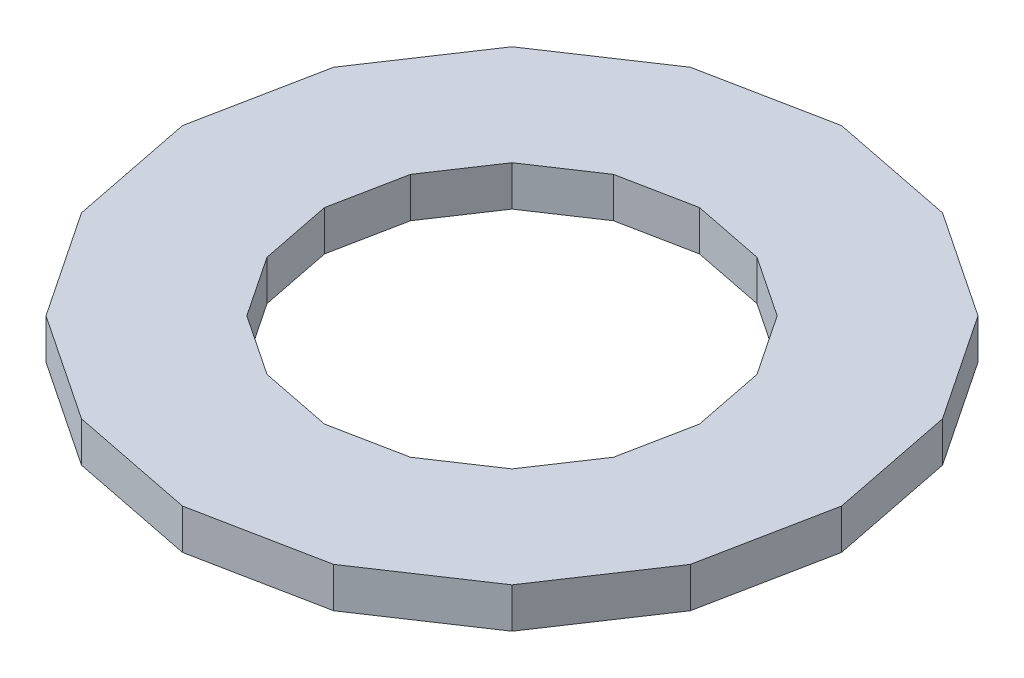
ISO-10303-21;
HEADER;
FILE_DESCRIPTION(('STEP AP214'),'2;1');
FILE_NAME('part.step','',(''),(''),'','','');
FILE_SCHEMA(('AUTOMOTIVE_DESIGN { 1 0 10303 214 1 1 1 1 }'));
ENDSEC;
DATA;
#1=APPLICATION_CONTEXT('core data for automotive mechanical design processes');
#2=APPLICATION_PROTOCOL_DEFINITION('international standard','automotive_design',2000,#1);
#3=PRODUCT_CONTEXT('',#1,'mechanical');
#4=PRODUCT('Part','Part','',(#3));
#5=PRODUCT_RELATED_PRODUCT_CATEGORY('part','',(#4));
#6=PRODUCT_DEFINITION_FORMATION('','',#4);
#7=PRODUCT_DEFINITION_CONTEXT('part definition',#1,'design');
#8=PRODUCT_DEFINITION('design','',#6,#7);
#9=PRODUCT_DEFINITION_SHAPE('','',#8);
#10=(LENGTH_UNIT() NAMED_UNIT(*) SI_UNIT(.MILLI.,.METRE.));
#11=(NAMED_UNIT(*) PLANE_ANGLE_UNIT() SI_UNIT($,.RADIAN.));
#12=(NAMED_UNIT(*) SI_UNIT($,.STERADIAN.) SOLID_ANGLE_UNIT());
#13=UNCERTAINTY_MEASURE_WITH_UNIT(LENGTH_MEASURE(1.E-05),#10,'distance_accuracy_value','');
#14=(GEOMETRIC_REPRESENTATION_CONTEXT(3) GLOBAL_UNCERTAINTY_ASSIGNED_CONTEXT((#13)) GLOBAL_UNIT_ASSIGNED_CONTEXT((#10,
#11,#12)) REPRESENTATION_CONTEXT('',''));
#15=CARTESIAN_POINT('',(0.,0.,0.));
#16=DIRECTION('',(0.,0.,1.));
#17=DIRECTION('',(1.,0.,0.));
#18=AXIS2_PLACEMENT_3D('',#15,#16,#17);
#19=CARTESIAN_POINT('',(0.,19.05,0.));
#20=DIRECTION('',(0.,1.,0.));
#21=DIRECTION('',(0.,0.,1.));
#22=AXIS2_PLACEMENT_3D('',#19,#20,#21);
#23=PLANE('',#22);
#24=DIRECTION('',(0.195090322016117,0.,-0.980785280403233));
#25=VECTOR('',#24,1.);
#26=CARTESIAN_POINT('',(144.34261966422,19.05,59.7886706933794));
#27=LINE('',#26,#25);
#28=CARTESIAN_POINT('',(144.34261966422,19.05,59.7886706933794));
#29=VERTEX_POINT('',#28);
#30=CARTESIAN_POINT('',(156.235325694323,19.05,-1.88390487844212E-12));
#31=VERTEX_POINT('',#30);
#32=EDGE_CURVE('E373',#29,#31,#27,.T.);
#33=ORIENTED_EDGE('',*,*,#32,.T.);
#34=DIRECTION('',(-0.19509032201614,0.,-0.980785280403228));
#35=VECTOR('',#34,1.);
#36=CARTESIAN_POINT('',(156.235325694323,19.05,-1.88390487844212E-12));
#37=LINE('',#36,#35);
#38=CARTESIAN_POINT('',(144.342619664219,19.05,-59.7886706933827));
#39=VERTEX_POINT('',#38);
#40=EDGE_CURVE('E376',#31,#39,#37,.T.);
#41=ORIENTED_EDGE('',*,*,#40,.T.);
#42=DIRECTION('',(-0.555570233019612,0.,-0.831469612302539));
#43=VECTOR('',#42,1.);
#44=CARTESIAN_POINT('',(144.342619664219,19.05,-59.7886706933827));
#45=LINE('',#44,#43);
#46=CARTESIAN_POINT('',(110.475058259343,19.05,-110.475058259346));
#47=VERTEX_POINT('',#46);
#48=EDGE_CURVE('E380',#39,#47,#45,.T.);
#49=ORIENTED_EDGE('',*,*,#48,.T.);
#50=DIRECTION('',(-0.831469612302552,0.,-0.555570233019592));
#51=VECTOR('',#50,1.);
#52=CARTESIAN_POINT('',(110.475058259343,19.05,-110.475058259346));
#53=LINE('',#52,#51);
#54=CARTESIAN_POINT('',(59.7886706933795,19.05,-144.34261966422));
#55=VERTEX_POINT('',#54);
#56=EDGE_CURVE('E383',#47,#55,#53,.T.);
#57=ORIENTED_EDGE('',*,*,#56,.T.);
#58=DIRECTION('',(-0.980785280403233,0.,-0.195090322016117));
#59=VECTOR('',#58,1.);
#60=CARTESIAN_POINT('',(59.7886706933795,19.05,-144.34261966422));
#61=LINE('',#60,#59);
#62=CARTESIAN_POINT('',(-1.93066864257627E-12,19.05,-156.235325694322));
#63=VERTEX_POINT('',#62);
#64=EDGE_CURVE('E385',#55,#63,#61,.T.);
#65=ORIENTED_EDGE('',*,*,#64,.T.);
#66=DIRECTION('',(-0.980785280403228,0.,0.19509032201614));
#67=VECTOR('',#66,1.);
#68=CARTESIAN_POINT('',(-1.93066864257627E-12,19.05,-156.235325694322));
#69=LINE('',#68,#67);
#70=CARTESIAN_POINT('',(-59.7886706933827,19.05,-144.342619664219));
#71=VERTEX_POINT('',#70);
#72=EDGE_CURVE('E387',#63,#71,#69,.T.);
#73=ORIENTED_EDGE('',*,*,#72,.T.);
#74=DIRECTION('',(-0.831469612302539,0.,0.555570233019612));
#75=VECTOR('',#74,1.);
#76=CARTESIAN_POINT('',(-59.7886706933827,19.05,-144.342619664219));
#77=LINE('',#76,#75);
#78=CARTESIAN_POINT('',(-110.475058259346,19.05,-110.475058259343));
#79=VERTEX_POINT('',#78);
#80=EDGE_CURVE('E389',#71,#79,#77,.T.);
#81=ORIENTED_EDGE('',*,*,#80,.T.);
#82=DIRECTION('',(-0.555570233019593,0.,0.831469612302552));
#83=VECTOR('',#82,1.);
#84=CARTESIAN_POINT('',(-110.475058259346,19.05,-110.475058259343));
#85=LINE('',#84,#83);
#86=CARTESIAN_POINT('',(-144.34261966422,19.05,-59.7886706933793));
#87=VERTEX_POINT('',#86);
#88=EDGE_CURVE('E391',#79,#87,#85,.T.);
#89=ORIENTED_EDGE('',*,*,#88,.T.);
#90=DIRECTION('',(-0.195090322016117,0.,0.980785280403233));
#91=VECTOR('',#90,1.);
#92=CARTESIAN_POINT('',(-144.34261966422,19.05,-59.7886706933793));
#93=LINE('',#92,#91);
#94=CARTESIAN_POINT('',(-156.235325694323,19.05,1.84640285279294E-12));
#95=VERTEX_POINT('',#94);
#96=EDGE_CURVE('E393',#87,#95,#93,.T.);
#97=ORIENTED_EDGE('',*,*,#96,.T.);
#98=DIRECTION('',(0.19509032201614,0.,0.980785280403228));
#99=VECTOR('',#98,1.);
#100=CARTESIAN_POINT('',(-156.235325694323,19.05,1.84640285279294E-12));
#101=LINE('',#100,#99);
#102=CARTESIAN_POINT('',(-144.342619664219,19.05,59.7886706933827));
#103=VERTEX_POINT('',#102);
#104=EDGE_CURVE('E395',#95,#103,#101,.T.);
#105=ORIENTED_EDGE('',*,*,#104,.T.);
#106=DIRECTION('',(0.555570233019612,0.,0.831469612302539));
#107=VECTOR('',#106,1.);
#108=CARTESIAN_POINT('',(-144.342619664219,19.05,59.7886706933827));
#109=LINE('',#108,#107);
#110=CARTESIAN_POINT('',(-110.475058259343,19.05,110.475058259346));
#111=VERTEX_POINT('',#110);
#112=EDGE_CURVE('E397',#103,#111,#109,.T.);
#113=ORIENTED_EDGE('',*,*,#112,.T.);
#114=DIRECTION('',(0.831469612302552,0.,0.555570233019593));
#115=VECTOR('',#114,1.);
#116=CARTESIAN_POINT('',(-110.475058259343,19.05,110.475058259346));
#117=LINE('',#116,#115);
#118=CARTESIAN_POINT('',(-59.7886706933794,19.05,144.34261966422));
#119=VERTEX_POINT('',#118);
#120=EDGE_CURVE('E399',#111,#119,#117,.T.);
#121=ORIENTED_EDGE('',*,*,#120,.T.);
#122=DIRECTION('',(0.980785280403233,0.,0.195090322016117));
#123=VECTOR('',#122,1.);
#124=CARTESIAN_POINT('',(-59.7886706933794,19.05,144.34261966422));
#125=LINE('',#124,#123);
#126=CARTESIAN_POINT('',(1.77199669578587E-12,19.05,156.235325694323));
#127=VERTEX_POINT('',#126);
#128=EDGE_CURVE('E401',#119,#127,#125,.T.);
#129=ORIENTED_EDGE('',*,*,#128,.T.);
#130=DIRECTION('',(0.980785280403228,0.,-0.19509032201614));
#131=VECTOR('',#130,1.);
#132=CARTESIAN_POINT('',(1.77199669578587E-12,19.05,156.235325694323));
#133=LINE('',#132,#131);
#134=CARTESIAN_POINT('',(59.7886706933828,19.05,144.342619664219));
#135=VERTEX_POINT('',#134);
#136=EDGE_CURVE('E403',#127,#135,#133,.T.);
#137=ORIENTED_EDGE('',*,*,#136,.T.);
#138=DIRECTION('',(0.831469612302539,0.,-0.555570233019612));
#139=VECTOR('',#138,1.);
#140=CARTESIAN_POINT('',(59.7886706933828,19.05,144.342619664219));
#141=LINE('',#140,#139);
#142=CARTESIAN_POINT('',(110.475058259346,19.05,110.475058259343));
#143=VERTEX_POINT('',#142);
#144=EDGE_CURVE('E405',#135,#143,#141,.T.);
#145=ORIENTED_EDGE('',*,*,#144,.T.);
#146=DIRECTION('',(0.555570233019593,0.,-0.831469612302552));
#147=VECTOR('',#146,1.);
#148=CARTESIAN_POINT('',(110.475058259346,19.05,110.475058259343));
#149=LINE('',#148,#147);
#150=EDGE_CURVE('E408',#143,#29,#149,.T.);
#151=ORIENTED_EDGE('',*,*,#150,.T.);
#152=EDGE_LOOP('',(#33,#41,#49,#57,#65,#73,#81,#89,#97,#105,#113,#121,#129,#137,#145,#151));
#153=FACE_BOUND('',#152,.T.);
#154=DIRECTION('',(-0.195090322016139,0.,-0.980785280403228));
#155=VECTOR('',#154,1.);
#156=CARTESIAN_POINT('',(88.9015256062453,19.05,-9.78525608629072E-13));
#157=LINE('',#156,#155);
#158=CARTESIAN_POINT('',(88.9015256062453,19.05,-9.78525608629072E-13));
#159=VERTEX_POINT('',#158);
#160=CARTESIAN_POINT('',(82.1342999166377,19.05,-34.0211409614918));
#161=VERTEX_POINT('',#160);
#162=EDGE_CURVE('E252',#159,#161,#157,.T.);
#163=ORIENTED_EDGE('',*,*,#162,.F.);
#164=DIRECTION('',(0.195090322016117,0.,-0.980785280403233));
#165=VECTOR('',#164,1.);
#166=CARTESIAN_POINT('',(82.1342999166385,19.05,34.0211409614899));
#167=LINE('',#166,#165);
#168=CARTESIAN_POINT('',(82.1342999166385,19.05,34.0211409614899));
#169=VERTEX_POINT('',#168);
#170=EDGE_CURVE('E244',#169,#159,#167,.T.);
#171=ORIENTED_EDGE('',*,*,#170,.F.);
#172=DIRECTION('',(0.555570233019593,0.,-0.831469612302551));
#173=VECTOR('',#172,1.);
#174=CARTESIAN_POINT('',(62.8628716140063,19.05,62.8628716140048));
#175=LINE('',#174,#173);
#176=CARTESIAN_POINT('',(62.8628716140063,19.05,62.8628716140048));
#177=VERTEX_POINT('',#176);
#178=EDGE_CURVE('E298',#177,#169,#175,.T.);
#179=ORIENTED_EDGE('',*,*,#178,.F.);
#180=DIRECTION('',(0.831469612302539,0.,-0.555570233019612));
#181=VECTOR('',#180,1.);
#182=CARTESIAN_POINT('',(34.0211409614918,19.05,82.1342999166377));
#183=LINE('',#182,#181);
#184=CARTESIAN_POINT('',(34.0211409614918,19.05,82.1342999166377));
#185=VERTEX_POINT('',#184);
#186=EDGE_CURVE('E295',#185,#177,#183,.T.);
#187=ORIENTED_EDGE('',*,*,#186,.F.);
#188=DIRECTION('',(0.980785280403228,0.,-0.19509032201614));
#189=VECTOR('',#188,1.);
#190=CARTESIAN_POINT('',(1.01814011942807E-12,19.05,88.9015256062453));
#191=LINE('',#190,#189);
#192=CARTESIAN_POINT('',(1.01814011942807E-12,19.05,88.9015256062453));
#193=VERTEX_POINT('',#192);
#194=EDGE_CURVE('E293',#193,#185,#191,.T.);
#195=ORIENTED_EDGE('',*,*,#194,.F.);
#196=DIRECTION('',(0.980785280403233,0.,0.195090322016117));
#197=VECTOR('',#196,1.);
#198=CARTESIAN_POINT('',(-34.0211409614898,19.05,82.1342999166385));
#199=LINE('',#198,#197);
#200=CARTESIAN_POINT('',(-34.0211409614898,19.05,82.1342999166385));
#201=VERTEX_POINT('',#200);
#202=EDGE_CURVE('E291',#201,#193,#199,.T.);
#203=ORIENTED_EDGE('',*,*,#202,.F.);
#204=DIRECTION('',(0.831469612302552,0.,0.555570233019592));
#205=VECTOR('',#204,1.);
#206=CARTESIAN_POINT('',(-62.8628716140048,19.05,62.8628716140062));
#207=LINE('',#206,#205);
#208=CARTESIAN_POINT('',(-62.8628716140048,19.05,62.8628716140062));
#209=VERTEX_POINT('',#208);
#210=EDGE_CURVE('E289',#209,#201,#207,.T.);
#211=ORIENTED_EDGE('',*,*,#210,.F.);
#212=DIRECTION('',(0.555570233019612,0.,0.831469612302539));
#213=VECTOR('',#212,1.);
#214=CARTESIAN_POINT('',(-82.1342999166376,19.05,34.0211409614918));
#215=LINE('',#214,#213);
#216=CARTESIAN_POINT('',(-82.1342999166376,19.05,34.0211409614918));
#217=VERTEX_POINT('',#216);
#218=EDGE_CURVE('E287',#217,#209,#215,.T.);
#219=ORIENTED_EDGE('',*,*,#218,.F.);
#220=DIRECTION('',(0.195090322016139,0.,0.980785280403228));
#221=VECTOR('',#220,1.);
#222=CARTESIAN_POINT('',(-88.9015256062452,19.05,1.01975640950873E-12));
#223=LINE('',#222,#221);
#224=CARTESIAN_POINT('',(-88.9015256062452,19.05,1.01975640950873E-12));
#225=VERTEX_POINT('',#224);
#226=EDGE_CURVE('E285',#225,#217,#223,.T.);
#227=ORIENTED_EDGE('',*,*,#226,.F.);
#228=DIRECTION('',(-0.195090322016117,0.,0.980785280403233));
#229=VECTOR('',#228,1.);
#230=CARTESIAN_POINT('',(-82.1342999166384,19.05,-34.0211409614899));
#231=LINE('',#230,#229);
#232=CARTESIAN_POINT('',(-82.1342999166384,19.05,-34.0211409614899));
#233=VERTEX_POINT('',#232);
#234=EDGE_CURVE('E283',#233,#225,#231,.T.);
#235=ORIENTED_EDGE('',*,*,#234,.F.);
#236=DIRECTION('',(-0.555570233019593,0.,0.831469612302552));
#237=VECTOR('',#236,1.);
#238=CARTESIAN_POINT('',(-62.8628716140062,19.05,-62.8628716140048));
#239=LINE('',#238,#237);
#240=CARTESIAN_POINT('',(-62.8628716140062,19.05,-62.8628716140048));
#241=VERTEX_POINT('',#240);
#242=EDGE_CURVE('E281',#241,#233,#239,.T.);
#243=ORIENTED_EDGE('',*,*,#242,.F.);
#244=DIRECTION('',(-0.831469612302539,0.,0.555570233019612));
#245=VECTOR('',#244,1.);
#246=CARTESIAN_POINT('',(-34.0211409614917,19.05,-82.1342999166377));
#247=LINE('',#246,#245);
#248=CARTESIAN_POINT('',(-34.0211409614917,19.05,-82.1342999166377));
#249=VERTEX_POINT('',#248);
#250=EDGE_CURVE('E279',#249,#241,#247,.T.);
#251=ORIENTED_EDGE('',*,*,#250,.F.);
#252=DIRECTION('',(-0.980785280403228,0.,0.19509032201614));
#253=VECTOR('',#252,1.);
#254=CARTESIAN_POINT('',(-1.06841590291588E-12,19.05,-88.9015256062452));
#255=LINE('',#254,#253);
#256=CARTESIAN_POINT('',(-1.06841590291588E-12,19.05,-88.9015256062452));
#257=VERTEX_POINT('',#256);
#258=EDGE_CURVE('E277',#257,#249,#255,.T.);
#259=ORIENTED_EDGE('',*,*,#258,.F.);
#260=DIRECTION('',(-0.980785280403233,0.,-0.195090322016117));
#261=VECTOR('',#260,1.);
#262=CARTESIAN_POINT('',(34.0211409614899,19.05,-82.1342999166384));
#263=LINE('',#262,#261);
#264=CARTESIAN_POINT('',(34.0211409614899,19.05,-82.1342999166384));
#265=VERTEX_POINT('',#264);
#266=EDGE_CURVE('E275',#265,#257,#263,.T.);
#267=ORIENTED_EDGE('',*,*,#266,.F.);
#268=DIRECTION('',(-0.831469612302552,0.,-0.555570233019592));
#269=VECTOR('',#268,1.);
#270=CARTESIAN_POINT('',(62.8628716140048,19.05,-62.8628716140062));
#271=LINE('',#270,#269);
#272=CARTESIAN_POINT('',(62.8628716140048,19.05,-62.8628716140062));
#273=VERTEX_POINT('',#272);
#274=EDGE_CURVE('E271',#273,#265,#271,.T.);
#275=ORIENTED_EDGE('',*,*,#274,.F.);
#276=DIRECTION('',(-0.555570233019612,0.,-0.831469612302539));
#277=VECTOR('',#276,1.);
#278=CARTESIAN_POINT('',(82.1342999166377,19.05,-34.0211409614918));
#279=LINE('',#278,#277);
#280=EDGE_CURVE('E265',#161,#273,#279,.T.);
#281=ORIENTED_EDGE('',*,*,#280,.F.);
#282=EDGE_LOOP('',(#163,#171,#179,#187,#195,#203,#211,#219,#227,#235,#243,#251,#259,#267,#275,#281));
#283=FACE_BOUND('',#282,.T.);
#284=ADVANCED_FACE('F35',(#153,#283),#23,.T.);
#285=CARTESIAN_POINT('',(0.,0.,0.));
#286=DIRECTION('',(0.,1.,0.));
#287=DIRECTION('',(0.,0.,1.));
#288=AXIS2_PLACEMENT_3D('',#285,#286,#287);
#289=PLANE('',#288);
#290=DIRECTION('',(0.195090322016117,0.,-0.980785280403233));
#291=VECTOR('',#290,1.);
#292=CARTESIAN_POINT('',(144.34261966422,0.,59.7886706933794));
#293=LINE('',#292,#291);
#294=CARTESIAN_POINT('',(144.34261966422,0.,59.7886706933794));
#295=VERTEX_POINT('',#294);
#296=CARTESIAN_POINT('',(156.235325694323,0.,-1.88390487844212E-12));
#297=VERTEX_POINT('',#296);
#298=EDGE_CURVE('E260',#295,#297,#293,.T.);
#299=ORIENTED_EDGE('',*,*,#298,.F.);
#300=DIRECTION('',(0.555570233019593,0.,-0.831469612302552));
#301=VECTOR('',#300,1.);
#302=CARTESIAN_POINT('',(110.475058259346,0.,110.475058259343));
#303=LINE('',#302,#301);
#304=CARTESIAN_POINT('',(110.475058259346,0.,110.475058259343));
#305=VERTEX_POINT('',#304);
#306=EDGE_CURVE('E377',#305,#295,#303,.T.);
#307=ORIENTED_EDGE('',*,*,#306,.F.);
#308=DIRECTION('',(0.831469612302539,0.,-0.555570233019612));
#309=VECTOR('',#308,1.);
#310=CARTESIAN_POINT('',(59.7886706933828,0.,144.342619664219));
#311=LINE('',#310,#309);
#312=CARTESIAN_POINT('',(59.7886706933828,0.,144.342619664219));
#313=VERTEX_POINT('',#312);
#314=EDGE_CURVE('E442',#313,#305,#311,.T.);
#315=ORIENTED_EDGE('',*,*,#314,.F.);
#316=DIRECTION('',(0.980785280403228,0.,-0.19509032201614));
#317=VECTOR('',#316,1.);
#318=CARTESIAN_POINT('',(1.77199669578587E-12,0.,156.235325694323));
#319=LINE('',#318,#317);
#320=CARTESIAN_POINT('',(1.77199669578587E-12,0.,156.235325694323));
#321=VERTEX_POINT('',#320);
#322=EDGE_CURVE('E440',#321,#313,#319,.T.);
#323=ORIENTED_EDGE('',*,*,#322,.F.);
#324=DIRECTION('',(0.980785280403233,0.,0.195090322016117));
#325=VECTOR('',#324,1.);
#326=CARTESIAN_POINT('',(-59.7886706933794,0.,144.34261966422));
#327=LINE('',#326,#325);
#328=CARTESIAN_POINT('',(-59.7886706933794,0.,144.34261966422));
#329=VERTEX_POINT('',#328);
#330=EDGE_CURVE('E437',#329,#321,#327,.T.);
#331=ORIENTED_EDGE('',*,*,#330,.F.);
#332=DIRECTION('',(0.831469612302552,0.,0.555570233019593));
#333=VECTOR('',#332,1.);
#334=CARTESIAN_POINT('',(-110.475058259343,0.,110.475058259346));
#335=LINE('',#334,#333);
#336=CARTESIAN_POINT('',(-110.475058259343,0.,110.475058259346));
#337=VERTEX_POINT('',#336);
#338=EDGE_CURVE('E434',#337,#329,#335,.T.);
#339=ORIENTED_EDGE('',*,*,#338,.F.);
#340=DIRECTION('',(0.555570233019612,0.,0.831469612302539));
#341=VECTOR('',#340,1.);
#342=CARTESIAN_POINT('',(-144.342619664219,0.,59.7886706933827));
#343=LINE('',#342,#341);
#344=CARTESIAN_POINT('',(-144.342619664219,0.,59.7886706933827));
#345=VERTEX_POINT('',#344);
#346=EDGE_CURVE('E432',#345,#337,#343,.T.);
#347=ORIENTED_EDGE('',*,*,#346,.F.);
#348=DIRECTION('',(0.19509032201614,0.,0.980785280403228));
#349=VECTOR('',#348,1.);
#350=CARTESIAN_POINT('',(-156.235325694323,0.,1.84640285279294E-12));
#351=LINE('',#350,#349);
#352=CARTESIAN_POINT('',(-156.235325694323,0.,1.84640285279294E-12));
#353=VERTEX_POINT('',#352);
#354=EDGE_CURVE('E430',#353,#345,#351,.T.);
#355=ORIENTED_EDGE('',*,*,#354,.F.);
#356=DIRECTION('',(-0.195090322016117,0.,0.980785280403233));
#357=VECTOR('',#356,1.);
#358=CARTESIAN_POINT('',(-144.34261966422,0.,-59.7886706933793));
#359=LINE('',#358,#357);
#360=CARTESIAN_POINT('',(-144.34261966422,0.,-59.7886706933793));
#361=VERTEX_POINT('',#360);
#362=EDGE_CURVE('E428',#361,#353,#359,.T.);
#363=ORIENTED_EDGE('',*,*,#362,.F.);
#364=DIRECTION('',(-0.555570233019593,0.,0.831469612302552));
#365=VECTOR('',#364,1.);
#366=CARTESIAN_POINT('',(-110.475058259346,0.,-110.475058259343));
#367=LINE('',#366,#365);
#368=CARTESIAN_POINT('',(-110.475058259346,0.,-110.475058259343));
#369=VERTEX_POINT('',#368);
#370=EDGE_CURVE('E426',#369,#361,#367,.T.);
#371=ORIENTED_EDGE('',*,*,#370,.F.);
#372=DIRECTION('',(-0.831469612302539,0.,0.555570233019612));
#373=VECTOR('',#372,1.);
#374=CARTESIAN_POINT('',(-59.7886706933827,0.,-144.342619664219));
#375=LINE('',#374,#373);
#376=CARTESIAN_POINT('',(-59.7886706933827,0.,-144.342619664219));
#377=VERTEX_POINT('',#376);
#378=EDGE_CURVE('E424',#377,#369,#375,.T.);
#379=ORIENTED_EDGE('',*,*,#378,.F.);
#380=DIRECTION('',(-0.980785280403228,0.,0.19509032201614));
#381=VECTOR('',#380,1.);
#382=CARTESIAN_POINT('',(-1.93066864257627E-12,0.,-156.235325694322));
#383=LINE('',#382,#381);
#384=CARTESIAN_POINT('',(-1.93066864257627E-12,0.,-156.235325694322));
#385=VERTEX_POINT('',#384);
#386=EDGE_CURVE('E422',#385,#377,#383,.T.);
#387=ORIENTED_EDGE('',*,*,#386,.F.);
#388=DIRECTION('',(-0.980785280403233,0.,-0.195090322016117));
#389=VECTOR('',#388,1.);
#390=CARTESIAN_POINT('',(59.7886706933795,0.,-144.34261966422));
#391=LINE('',#390,#389);
#392=CARTESIAN_POINT('',(59.7886706933795,0.,-144.34261966422));
#393=VERTEX_POINT('',#392);
#394=EDGE_CURVE('E420',#393,#385,#391,.T.);
#395=ORIENTED_EDGE('',*,*,#394,.F.);
#396=DIRECTION('',(-0.831469612302552,0.,-0.555570233019592));
#397=VECTOR('',#396,1.);
#398=CARTESIAN_POINT('',(110.475058259343,0.,-110.475058259346));
#399=LINE('',#398,#397);
#400=CARTESIAN_POINT('',(110.475058259343,0.,-110.475058259346));
#401=VERTEX_POINT('',#400);
#402=EDGE_CURVE('E418',#401,#393,#399,.T.);
#403=ORIENTED_EDGE('',*,*,#402,.F.);
#404=DIRECTION('',(-0.555570233019612,0.,-0.831469612302539));
#405=VECTOR('',#404,1.);
#406=CARTESIAN_POINT('',(144.342619664219,0.,-59.7886706933827));
#407=LINE('',#406,#405);
#408=CARTESIAN_POINT('',(144.342619664219,0.,-59.7886706933827));
#409=VERTEX_POINT('',#408);
#410=EDGE_CURVE('E415',#409,#401,#407,.T.);
#411=ORIENTED_EDGE('',*,*,#410,.F.);
#412=DIRECTION('',(-0.19509032201614,0.,-0.980785280403228));
#413=VECTOR('',#412,1.);
#414=CARTESIAN_POINT('',(156.235325694323,0.,-1.88390487844212E-12));
#415=LINE('',#414,#413);
#416=EDGE_CURVE('E413',#297,#409,#415,.T.);
#417=ORIENTED_EDGE('',*,*,#416,.F.);
#418=EDGE_LOOP('',(#299,#307,#315,#323,#331,#339,#347,#355,#363,#371,#379,#387,#395,#403,#411,#417));
#419=FACE_BOUND('',#418,.T.);
#420=DIRECTION('',(0.195090322016117,0.,-0.980785280403233));
#421=VECTOR('',#420,1.);
#422=CARTESIAN_POINT('',(82.1342999166385,0.,34.0211409614899));
#423=LINE('',#422,#421);
#424=CARTESIAN_POINT('',(82.1342999166385,0.,34.0211409614899));
#425=VERTEX_POINT('',#424);
#426=CARTESIAN_POINT('',(88.9015256062453,0.,-9.78525608629072E-13));
#427=VERTEX_POINT('',#426);
#428=EDGE_CURVE('E58',#425,#427,#423,.T.);
#429=ORIENTED_EDGE('',*,*,#428,.T.);
#430=DIRECTION('',(-0.195090322016139,0.,-0.980785280403228));
#431=VECTOR('',#430,1.);
#432=CARTESIAN_POINT('',(88.9015256062453,0.,-9.78525608629072E-13));
#433=LINE('',#432,#431);
#434=CARTESIAN_POINT('',(82.1342999166377,0.,-34.0211409614918));
#435=VERTEX_POINT('',#434);
#436=EDGE_CURVE('E259',#427,#435,#433,.T.);
#437=ORIENTED_EDGE('',*,*,#436,.T.);
#438=DIRECTION('',(-0.555570233019612,0.,-0.831469612302539));
#439=VECTOR('',#438,1.);
#440=CARTESIAN_POINT('',(82.1342999166377,0.,-34.0211409614918));
#441=LINE('',#440,#439);
#442=CARTESIAN_POINT('',(62.8628716140048,0.,-62.8628716140062));
#443=VERTEX_POINT('',#442);
#444=EDGE_CURVE('E302',#435,#443,#441,.T.);
#445=ORIENTED_EDGE('',*,*,#444,.T.);
#446=DIRECTION('',(-0.831469612302552,0.,-0.555570233019592));
#447=VECTOR('',#446,1.);
#448=CARTESIAN_POINT('',(62.8628716140048,0.,-62.8628716140062));
#449=LINE('',#448,#447);
#450=CARTESIAN_POINT('',(34.0211409614899,0.,-82.1342999166384));
#451=VERTEX_POINT('',#450);
#452=EDGE_CURVE('E305',#443,#451,#449,.T.);
#453=ORIENTED_EDGE('',*,*,#452,.T.);
#454=DIRECTION('',(-0.980785280403233,0.,-0.195090322016117));
#455=VECTOR('',#454,1.);
#456=CARTESIAN_POINT('',(34.0211409614899,0.,-82.1342999166384));
#457=LINE('',#456,#455);
#458=CARTESIAN_POINT('',(-1.06841590291588E-12,0.,-88.9015256062452));
#459=VERTEX_POINT('',#458);
#460=EDGE_CURVE('E308',#451,#459,#457,.T.);
#461=ORIENTED_EDGE('',*,*,#460,.T.);
#462=DIRECTION('',(-0.980785280403228,0.,0.19509032201614));
#463=VECTOR('',#462,1.);
#464=CARTESIAN_POINT('',(-1.06841590291588E-12,0.,-88.9015256062452));
#465=LINE('',#464,#463);
#466=CARTESIAN_POINT('',(-34.0211409614917,0.,-82.1342999166377));
#467=VERTEX_POINT('',#466);
#468=EDGE_CURVE('E311',#459,#467,#465,.T.);
#469=ORIENTED_EDGE('',*,*,#468,.T.);
#470=DIRECTION('',(-0.831469612302539,0.,0.555570233019612));
#471=VECTOR('',#470,1.);
#472=CARTESIAN_POINT('',(-34.0211409614917,0.,-82.1342999166377));
#473=LINE('',#472,#471);
#474=CARTESIAN_POINT('',(-62.8628716140062,0.,-62.8628716140048));
#475=VERTEX_POINT('',#474);
#476=EDGE_CURVE('E314',#467,#475,#473,.T.);
#477=ORIENTED_EDGE('',*,*,#476,.T.);
#478=DIRECTION('',(-0.555570233019593,0.,0.831469612302552));
#479=VECTOR('',#478,1.);
#480=CARTESIAN_POINT('',(-62.8628716140062,0.,-62.8628716140048));
#481=LINE('',#480,#479);
#482=CARTESIAN_POINT('',(-82.1342999166384,0.,-34.0211409614899));
#483=VERTEX_POINT('',#482);
#484=EDGE_CURVE('E317',#475,#483,#481,.T.);
#485=ORIENTED_EDGE('',*,*,#484,.T.);
#486=DIRECTION('',(-0.195090322016117,0.,0.980785280403233));
#487=VECTOR('',#486,1.);
#488=CARTESIAN_POINT('',(-82.1342999166384,0.,-34.0211409614899));
#489=LINE('',#488,#487);
#490=CARTESIAN_POINT('',(-88.9015256062452,0.,1.01975640950873E-12));
#491=VERTEX_POINT('',#490);
#492=EDGE_CURVE('E320',#483,#491,#489,.T.);
#493=ORIENTED_EDGE('',*,*,#492,.T.);
#494=DIRECTION('',(0.195090322016139,0.,0.980785280403228));
#495=VECTOR('',#494,1.);
#496=CARTESIAN_POINT('',(-88.9015256062452,0.,1.01975640950873E-12));
#497=LINE('',#496,#495);
#498=CARTESIAN_POINT('',(-82.1342999166376,0.,34.0211409614918));
#499=VERTEX_POINT('',#498);
#500=EDGE_CURVE('E323',#491,#499,#497,.T.);
#501=ORIENTED_EDGE('',*,*,#500,.T.);
#502=DIRECTION('',(0.555570233019612,0.,0.831469612302539));
#503=VECTOR('',#502,1.);
#504=CARTESIAN_POINT('',(-82.1342999166376,0.,34.0211409614918));
#505=LINE('',#504,#503);
#506=CARTESIAN_POINT('',(-62.8628716140048,0.,62.8628716140062));
#507=VERTEX_POINT('',#506);
#508=EDGE_CURVE('E326',#499,#507,#505,.T.);
#509=ORIENTED_EDGE('',*,*,#508,.T.);
#510=DIRECTION('',(0.831469612302552,0.,0.555570233019592));
#511=VECTOR('',#510,1.);
#512=CARTESIAN_POINT('',(-62.8628716140048,0.,62.8628716140062));
#513=LINE('',#512,#511);
#514=CARTESIAN_POINT('',(-34.0211409614898,0.,82.1342999166385));
#515=VERTEX_POINT('',#514);
#516=EDGE_CURVE('E330',#507,#515,#513,.T.);
#517=ORIENTED_EDGE('',*,*,#516,.T.);
#518=DIRECTION('',(0.980785280403233,0.,0.195090322016117));
#519=VECTOR('',#518,1.);
#520=CARTESIAN_POINT('',(-34.0211409614898,0.,82.1342999166385));
#521=LINE('',#520,#519);
#522=CARTESIAN_POINT('',(1.01814011942807E-12,0.,88.9015256062453));
#523=VERTEX_POINT('',#522);
#524=EDGE_CURVE('E333',#515,#523,#521,.T.);
#525=ORIENTED_EDGE('',*,*,#524,.T.);
#526=DIRECTION('',(0.980785280403228,0.,-0.19509032201614));
#527=VECTOR('',#526,1.);
#528=CARTESIAN_POINT('',(1.01814011942807E-12,0.,88.9015256062453));
#529=LINE('',#528,#527);
#530=CARTESIAN_POINT('',(34.0211409614918,0.,82.1342999166377));
#531=VERTEX_POINT('',#530);
#532=EDGE_CURVE('E336',#523,#531,#529,.T.);
#533=ORIENTED_EDGE('',*,*,#532,.T.);
#534=DIRECTION('',(0.831469612302539,0.,-0.555570233019612));
#535=VECTOR('',#534,1.);
#536=CARTESIAN_POINT('',(34.0211409614918,0.,82.1342999166377));
#537=LINE('',#536,#535);
#538=CARTESIAN_POINT('',(62.8628716140063,0.,62.8628716140048));
#539=VERTEX_POINT('',#538);
#540=EDGE_CURVE('E339',#531,#539,#537,.T.);
#541=ORIENTED_EDGE('',*,*,#540,.T.);
#542=DIRECTION('',(0.555570233019593,0.,-0.831469612302551));
#543=VECTOR('',#542,1.);
#544=CARTESIAN_POINT('',(62.8628716140063,0.,62.8628716140048));
#545=LINE('',#544,#543);
#546=EDGE_CURVE('E253',#539,#425,#545,.T.);
#547=ORIENTED_EDGE('',*,*,#546,.T.);
#548=EDGE_LOOP('',(#429,#437,#445,#453,#461,#469,#477,#485,#493,#501,#509,#517,#525,#533,#541,#547));
#549=FACE_BOUND('',#548,.T.);
#550=ADVANCED_FACE('F502',(#419,#549),#289,.F.);
#551=CARTESIAN_POINT('',(144.34261966422,19.05,59.7886706933794));
#552=DIRECTION('',(-0.980785280403233,0.,-0.195090322016117));
#553=DIRECTION('',(-0.195090322016117,0.,0.980785280403233));
#554=AXIS2_PLACEMENT_3D('',#551,#552,#553);
#555=PLANE('',#554);
#556=ORIENTED_EDGE('',*,*,#298,.T.);
#557=DIRECTION('',(0.,-1.,0.));
#558=VECTOR('',#557,1.);
#559=CARTESIAN_POINT('',(156.235325694323,19.05,-1.88390487844212E-12));
#560=LINE('',#559,#558);
#561=EDGE_CURVE('E11',#31,#297,#560,.T.);
#562=ORIENTED_EDGE('',*,*,#561,.F.);
#563=ORIENTED_EDGE('',*,*,#32,.F.);
#564=DIRECTION('',(0.,-1.,0.));
#565=VECTOR('',#564,1.);
#566=CARTESIAN_POINT('',(144.34261966422,19.05,59.7886706933794));
#567=LINE('',#566,#565);
#568=EDGE_CURVE('E410',#29,#295,#567,.T.);
#569=ORIENTED_EDGE('',*,*,#568,.T.);
#570=EDGE_LOOP('',(#556,#562,#563,#569));
#571=FACE_BOUND('',#570,.T.);
#572=ADVANCED_FACE('F37',(#571),#555,.F.);
#573=CARTESIAN_POINT('',(156.235325694323,19.05,-1.88390487844212E-12));
#574=DIRECTION('',(-0.980785280403228,0.,0.195090322016139));
#575=DIRECTION('',(0.195090322016139,0.,0.980785280403228));
#576=AXIS2_PLACEMENT_3D('',#573,#574,#575);
#577=PLANE('',#576);
#578=ORIENTED_EDGE('',*,*,#416,.T.);
#579=DIRECTION('',(0.,-1.,0.));
#580=VECTOR('',#579,1.);
#581=CARTESIAN_POINT('',(144.342619664219,19.05,-59.7886706933827));
#582=LINE('',#581,#580);
#583=EDGE_CURVE('E43',#39,#409,#582,.T.);
#584=ORIENTED_EDGE('',*,*,#583,.F.);
#585=ORIENTED_EDGE('',*,*,#40,.F.);
#586=ORIENTED_EDGE('',*,*,#561,.T.);
#587=EDGE_LOOP('',(#578,#584,#585,#586));
#588=FACE_BOUND('',#587,.T.);
#589=ADVANCED_FACE('F519',(#588),#577,.F.);
#590=CARTESIAN_POINT('',(144.342619664219,19.05,-59.7886706933827));
#591=DIRECTION('',(-0.831469612302539,0.,0.555570233019612));
#592=DIRECTION('',(0.555570233019612,0.,0.831469612302539));
#593=AXIS2_PLACEMENT_3D('',#590,#591,#592);
#594=PLANE('',#593);
#595=ORIENTED_EDGE('',*,*,#410,.T.);
#596=DIRECTION('',(0.,-1.,0.));
#597=VECTOR('',#596,1.);
#598=CARTESIAN_POINT('',(110.475058259343,19.05,-110.475058259346));
#599=LINE('',#598,#597);
#600=EDGE_CURVE('E487',#47,#401,#599,.T.);
#601=ORIENTED_EDGE('',*,*,#600,.F.);
#602=ORIENTED_EDGE('',*,*,#48,.F.);
#603=ORIENTED_EDGE('',*,*,#583,.T.);
#604=EDGE_LOOP('',(#595,#601,#602,#603));
#605=FACE_BOUND('',#604,.T.);
#606=ADVANCED_FACE('F496',(#605),#594,.F.);
#607=CARTESIAN_POINT('',(110.475058259343,19.05,-110.475058259346));
#608=DIRECTION('',(-0.555570233019592,0.,0.831469612302552));
#609=DIRECTION('',(0.831469612302552,0.,0.555570233019592));
#610=AXIS2_PLACEMENT_3D('',#607,#608,#609);
#611=PLANE('',#610);
#612=ORIENTED_EDGE('',*,*,#402,.T.);
#613=DIRECTION('',(0.,-1.,0.));
#614=VECTOR('',#613,1.);
#615=CARTESIAN_POINT('',(59.7886706933795,19.05,-144.34261966422));
#616=LINE('',#615,#614);
#617=EDGE_CURVE('E484',#55,#393,#616,.T.);
#618=ORIENTED_EDGE('',*,*,#617,.F.);
#619=ORIENTED_EDGE('',*,*,#56,.F.);
#620=ORIENTED_EDGE('',*,*,#600,.T.);
#621=EDGE_LOOP('',(#612,#618,#619,#620));
#622=FACE_BOUND('',#621,.T.);
#623=ADVANCED_FACE('F508',(#622),#611,.F.);
#624=CARTESIAN_POINT('',(59.7886706933795,19.05,-144.34261966422));
#625=DIRECTION('',(-0.195090322016117,0.,0.980785280403233));
#626=DIRECTION('',(0.980785280403233,0.,0.195090322016117));
#627=AXIS2_PLACEMENT_3D('',#624,#625,#626);
#628=PLANE('',#627);
#629=ORIENTED_EDGE('',*,*,#394,.T.);
#630=DIRECTION('',(0.,-1.,0.));
#631=VECTOR('',#630,1.);
#632=CARTESIAN_POINT('',(-1.93066864257627E-12,19.05,-156.235325694322));
#633=LINE('',#632,#631);
#634=EDGE_CURVE('E481',#63,#385,#633,.T.);
#635=ORIENTED_EDGE('',*,*,#634,.F.);
#636=ORIENTED_EDGE('',*,*,#64,.F.);
#637=ORIENTED_EDGE('',*,*,#617,.T.);
#638=EDGE_LOOP('',(#629,#635,#636,#637));
#639=FACE_BOUND('',#638,.T.);
#640=ADVANCED_FACE('F512',(#639),#628,.F.);
#641=CARTESIAN_POINT('',(-1.93066864257627E-12,19.05,-156.235325694322));
#642=DIRECTION('',(0.19509032201614,0.,0.980785280403228));
#643=DIRECTION('',(0.980785280403228,0.,-0.19509032201614));
#644=AXIS2_PLACEMENT_3D('',#641,#642,#643);
#645=PLANE('',#644);
#646=ORIENTED_EDGE('',*,*,#386,.T.);
#647=DIRECTION('',(0.,-1.,0.));
#648=VECTOR('',#647,1.);
#649=CARTESIAN_POINT('',(-59.7886706933827,19.05,-144.342619664219));
#650=LINE('',#649,#648);
#651=EDGE_CURVE('E477',#71,#377,#650,.T.);
#652=ORIENTED_EDGE('',*,*,#651,.F.);
#653=ORIENTED_EDGE('',*,*,#72,.F.);
#654=ORIENTED_EDGE('',*,*,#634,.T.);
#655=EDGE_LOOP('',(#646,#652,#653,#654));
#656=FACE_BOUND('',#655,.T.);
#657=ADVANCED_FACE('F572',(#656),#645,.F.);
#658=CARTESIAN_POINT('',(-59.7886706933827,19.05,-144.342619664219));
#659=DIRECTION('',(0.555570233019612,0.,0.831469612302539));
#660=DIRECTION('',(0.831469612302539,0.,-0.555570233019612));
#661=AXIS2_PLACEMENT_3D('',#658,#659,#660);
#662=PLANE('',#661);
#663=ORIENTED_EDGE('',*,*,#378,.T.);
#664=DIRECTION('',(0.,-1.,0.));
#665=VECTOR('',#664,1.);
#666=CARTESIAN_POINT('',(-110.475058259346,19.05,-110.475058259343));
#667=LINE('',#666,#665);
#668=EDGE_CURVE('E474',#79,#369,#667,.T.);
#669=ORIENTED_EDGE('',*,*,#668,.F.);
#670=ORIENTED_EDGE('',*,*,#80,.F.);
#671=ORIENTED_EDGE('',*,*,#651,.T.);
#672=EDGE_LOOP('',(#663,#669,#670,#671));
#673=FACE_BOUND('',#672,.T.);
#674=ADVANCED_FACE('F569',(#673),#662,.F.);
#675=CARTESIAN_POINT('',(-110.475058259346,19.05,-110.475058259343));
#676=DIRECTION('',(0.831469612302552,0.,0.555570233019593));
#677=DIRECTION('',(0.555570233019593,0.,-0.831469612302552));
#678=AXIS2_PLACEMENT_3D('',#675,#676,#677);
#679=PLANE('',#678);
#680=ORIENTED_EDGE('',*,*,#370,.T.);
#681=DIRECTION('',(0.,-1.,0.));
#682=VECTOR('',#681,1.);
#683=CARTESIAN_POINT('',(-144.34261966422,19.05,-59.7886706933793));
#684=LINE('',#683,#682);
#685=EDGE_CURVE('E471',#87,#361,#684,.T.);
#686=ORIENTED_EDGE('',*,*,#685,.F.);
#687=ORIENTED_EDGE('',*,*,#88,.F.);
#688=ORIENTED_EDGE('',*,*,#668,.T.);
#689=EDGE_LOOP('',(#680,#686,#687,#688));
#690=FACE_BOUND('',#689,.T.);
#691=ADVANCED_FACE('F565',(#690),#679,.F.);
#692=CARTESIAN_POINT('',(-144.34261966422,19.05,-59.7886706933793));
#693=DIRECTION('',(0.980785280403233,0.,0.195090322016117));
#694=DIRECTION('',(0.195090322016117,0.,-0.980785280403233));
#695=AXIS2_PLACEMENT_3D('',#692,#693,#694);
#696=PLANE('',#695);
#697=ORIENTED_EDGE('',*,*,#362,.T.);
#698=DIRECTION('',(0.,-1.,0.));
#699=VECTOR('',#698,1.);
#700=CARTESIAN_POINT('',(-156.235325694323,19.05,1.84640285279294E-12));
#701=LINE('',#700,#699);
#702=EDGE_CURVE('E468',#95,#353,#701,.T.);
#703=ORIENTED_EDGE('',*,*,#702,.F.);
#704=ORIENTED_EDGE('',*,*,#96,.F.);
#705=ORIENTED_EDGE('',*,*,#685,.T.);
#706=EDGE_LOOP('',(#697,#703,#704,#705));
#707=FACE_BOUND('',#706,.T.);
#708=ADVANCED_FACE('F561',(#707),#696,.F.);
#709=CARTESIAN_POINT('',(-156.235325694323,19.05,1.84640285279294E-12));
#710=DIRECTION('',(0.980785280403228,0.,-0.19509032201614));
#711=DIRECTION('',(-0.19509032201614,0.,-0.980785280403228));
#712=AXIS2_PLACEMENT_3D('',#709,#710,#711);
#713=PLANE('',#712);
#714=ORIENTED_EDGE('',*,*,#354,.T.);
#715=DIRECTION('',(0.,-1.,0.));
#716=VECTOR('',#715,1.);
#717=CARTESIAN_POINT('',(-144.342619664219,19.05,59.7886706933827));
#718=LINE('',#717,#716);
#719=EDGE_CURVE('E465',#103,#345,#718,.T.);
#720=ORIENTED_EDGE('',*,*,#719,.F.);
#721=ORIENTED_EDGE('',*,*,#104,.F.);
#722=ORIENTED_EDGE('',*,*,#702,.T.);
#723=EDGE_LOOP('',(#714,#720,#721,#722));
#724=FACE_BOUND('',#723,.T.);
#725=ADVANCED_FACE('F556',(#724),#713,.F.);
#726=CARTESIAN_POINT('',(-144.342619664219,19.05,59.7886706933827));
#727=DIRECTION('',(0.831469612302539,0.,-0.555570233019612));
#728=DIRECTION('',(-0.555570233019612,0.,-0.831469612302539));
#729=AXIS2_PLACEMENT_3D('',#726,#727,#728);
#730=PLANE('',#729);
#731=ORIENTED_EDGE('',*,*,#346,.T.);
#732=DIRECTION('',(0.,-1.,0.));
#733=VECTOR('',#732,1.);
#734=CARTESIAN_POINT('',(-110.475058259343,19.05,110.475058259346));
#735=LINE('',#734,#733);
#736=EDGE_CURVE('E462',#111,#337,#735,.T.);
#737=ORIENTED_EDGE('',*,*,#736,.F.);
#738=ORIENTED_EDGE('',*,*,#112,.F.);
#739=ORIENTED_EDGE('',*,*,#719,.T.);
#740=EDGE_LOOP('',(#731,#737,#738,#739));
#741=FACE_BOUND('',#740,.T.);
#742=ADVANCED_FACE('F550',(#741),#730,.F.);
#743=CARTESIAN_POINT('',(-110.475058259343,19.05,110.475058259346));
#744=DIRECTION('',(0.555570233019593,0.,-0.831469612302552));
#745=DIRECTION('',(-0.831469612302552,0.,-0.555570233019593));
#746=AXIS2_PLACEMENT_3D('',#743,#744,#745);
#747=PLANE('',#746);
#748=ORIENTED_EDGE('',*,*,#338,.T.);
#749=DIRECTION('',(0.,-1.,0.));
#750=VECTOR('',#749,1.);
#751=CARTESIAN_POINT('',(-59.7886706933794,19.05,144.34261966422));
#752=LINE('',#751,#750);
#753=EDGE_CURVE('E459',#119,#329,#752,.T.);
#754=ORIENTED_EDGE('',*,*,#753,.F.);
#755=ORIENTED_EDGE('',*,*,#120,.F.);
#756=ORIENTED_EDGE('',*,*,#736,.T.);
#757=EDGE_LOOP('',(#748,#754,#755,#756));
#758=FACE_BOUND('',#757,.T.);
#759=ADVANCED_FACE('F546',(#758),#747,.F.);
#760=CARTESIAN_POINT('',(-59.7886706933794,19.05,144.34261966422));
#761=DIRECTION('',(0.195090322016117,0.,-0.980785280403233));
#762=DIRECTION('',(-0.980785280403233,0.,-0.195090322016117));
#763=AXIS2_PLACEMENT_3D('',#760,#761,#762);
#764=PLANE('',#763);
#765=ORIENTED_EDGE('',*,*,#330,.T.);
#766=DIRECTION('',(0.,-1.,0.));
#767=VECTOR('',#766,1.);
#768=CARTESIAN_POINT('',(1.77199669578587E-12,19.05,156.235325694323));
#769=LINE('',#768,#767);
#770=EDGE_CURVE('E456',#127,#321,#769,.T.);
#771=ORIENTED_EDGE('',*,*,#770,.F.);
#772=ORIENTED_EDGE('',*,*,#128,.F.);
#773=ORIENTED_EDGE('',*,*,#753,.T.);
#774=EDGE_LOOP('',(#765,#771,#772,#773));
#775=FACE_BOUND('',#774,.T.);
#776=ADVANCED_FACE('F541',(#775),#764,.F.);
#777=CARTESIAN_POINT('',(1.77199669578587E-12,19.05,156.235325694323));
#778=DIRECTION('',(-0.19509032201614,0.,-0.980785280403228));
#779=DIRECTION('',(-0.980785280403228,0.,0.19509032201614));
#780=AXIS2_PLACEMENT_3D('',#777,#778,#779);
#781=PLANE('',#780);
#782=ORIENTED_EDGE('',*,*,#322,.T.);
#783=DIRECTION('',(0.,-1.,0.));
#784=VECTOR('',#783,1.);
#785=CARTESIAN_POINT('',(59.7886706933828,19.05,144.342619664219));
#786=LINE('',#785,#784);
#787=EDGE_CURVE('E452',#135,#313,#786,.T.);
#788=ORIENTED_EDGE('',*,*,#787,.F.);
#789=ORIENTED_EDGE('',*,*,#136,.F.);
#790=ORIENTED_EDGE('',*,*,#770,.T.);
#791=EDGE_LOOP('',(#782,#788,#789,#790));
#792=FACE_BOUND('',#791,.T.);
#793=ADVANCED_FACE('F535',(#792),#781,.F.);
#794=CARTESIAN_POINT('',(59.7886706933828,19.05,144.342619664219));
#795=DIRECTION('',(-0.555570233019612,0.,-0.831469612302539));
#796=DIRECTION('',(-0.831469612302539,0.,0.555570233019612));
#797=AXIS2_PLACEMENT_3D('',#794,#795,#796);
#798=PLANE('',#797);
#799=ORIENTED_EDGE('',*,*,#314,.T.);
#800=DIRECTION('',(0.,-1.,0.));
#801=VECTOR('',#800,1.);
#802=CARTESIAN_POINT('',(110.475058259346,19.05,110.475058259343));
#803=LINE('',#802,#801);
#804=EDGE_CURVE('E449',#143,#305,#803,.T.);
#805=ORIENTED_EDGE('',*,*,#804,.F.);
#806=ORIENTED_EDGE('',*,*,#144,.F.);
#807=ORIENTED_EDGE('',*,*,#787,.T.);
#808=EDGE_LOOP('',(#799,#805,#806,#807));
#809=FACE_BOUND('',#808,.T.);
#810=ADVANCED_FACE('F531',(#809),#798,.F.);
#811=CARTESIAN_POINT('',(110.475058259346,19.05,110.475058259343));
#812=DIRECTION('',(-0.831469612302552,0.,-0.555570233019593));
#813=DIRECTION('',(-0.555570233019593,0.,0.831469612302552));
#814=AXIS2_PLACEMENT_3D('',#811,#812,#813);
#815=PLANE('',#814);
#816=ORIENTED_EDGE('',*,*,#306,.T.);
#817=ORIENTED_EDGE('',*,*,#568,.F.);
#818=ORIENTED_EDGE('',*,*,#150,.F.);
#819=ORIENTED_EDGE('',*,*,#804,.T.);
#820=EDGE_LOOP('',(#816,#817,#818,#819));
#821=FACE_BOUND('',#820,.T.);
#822=ADVANCED_FACE('F526',(#821),#815,.F.);
#823=CARTESIAN_POINT('',(82.1342999166385,19.05,34.0211409614899));
#824=DIRECTION('',(-0.980785280403233,0.,-0.195090322016117));
#825=DIRECTION('',(-0.195090322016117,0.,0.980785280403233));
#826=AXIS2_PLACEMENT_3D('',#823,#824,#825);
#827=PLANE('',#826);
#828=ORIENTED_EDGE('',*,*,#428,.F.);
#829=DIRECTION('',(0.,-1.,0.));
#830=VECTOR('',#829,1.);
#831=CARTESIAN_POINT('',(82.1342999166385,19.05,34.0211409614899));
#832=LINE('',#831,#830);
#833=EDGE_CURVE('E248',#169,#425,#832,.T.);
#834=ORIENTED_EDGE('',*,*,#833,.F.);
#835=ORIENTED_EDGE('',*,*,#170,.T.);
#836=DIRECTION('',(0.,-1.,0.));
#837=VECTOR('',#836,1.);
#838=CARTESIAN_POINT('',(88.9015256062453,19.05,-9.78525608629072E-13));
#839=LINE('',#838,#837);
#840=EDGE_CURVE('E247',#159,#427,#839,.T.);
#841=ORIENTED_EDGE('',*,*,#840,.T.);
#842=EDGE_LOOP('',(#828,#834,#835,#841));
#843=FACE_BOUND('',#842,.T.);
#844=ADVANCED_FACE('F246',(#843),#827,.T.);
#845=CARTESIAN_POINT('',(88.9015256062453,19.05,-9.78525608629072E-13));
#846=DIRECTION('',(-0.980785280403228,0.,0.195090322016139));
#847=DIRECTION('',(0.195090322016139,0.,0.980785280403228));
#848=AXIS2_PLACEMENT_3D('',#845,#846,#847);
#849=PLANE('',#848);
#850=ORIENTED_EDGE('',*,*,#436,.F.);
#851=ORIENTED_EDGE('',*,*,#840,.F.);
#852=ORIENTED_EDGE('',*,*,#162,.T.);
#853=DIRECTION('',(0.,-1.,0.));
#854=VECTOR('',#853,1.);
#855=CARTESIAN_POINT('',(82.1342999166377,19.05,-34.0211409614918));
#856=LINE('',#855,#854);
#857=EDGE_CURVE('E261',#161,#435,#856,.T.);
#858=ORIENTED_EDGE('',*,*,#857,.T.);
#859=EDGE_LOOP('',(#850,#851,#852,#858));
#860=FACE_BOUND('',#859,.T.);
#861=ADVANCED_FACE('F256',(#860),#849,.T.);
#862=CARTESIAN_POINT('',(82.1342999166377,19.05,-34.0211409614918));
#863=DIRECTION('',(-0.831469612302539,0.,0.555570233019612));
#864=DIRECTION('',(0.555570233019612,0.,0.831469612302539));
#865=AXIS2_PLACEMENT_3D('',#862,#863,#864);
#866=PLANE('',#865);
#867=ORIENTED_EDGE('',*,*,#444,.F.);
#868=ORIENTED_EDGE('',*,*,#857,.F.);
#869=ORIENTED_EDGE('',*,*,#280,.T.);
#870=DIRECTION('',(0.,-1.,0.));
#871=VECTOR('',#870,1.);
#872=CARTESIAN_POINT('',(62.8628716140048,19.05,-62.8628716140062));
#873=LINE('',#872,#871);
#874=EDGE_CURVE('E369',#273,#443,#873,.T.);
#875=ORIENTED_EDGE('',*,*,#874,.T.);
#876=EDGE_LOOP('',(#867,#868,#869,#875));
#877=FACE_BOUND('',#876,.T.);
#878=ADVANCED_FACE('F654',(#877),#866,.T.);
#879=CARTESIAN_POINT('',(62.8628716140048,19.05,-62.8628716140062));
#880=DIRECTION('',(-0.555570233019592,0.,0.831469612302552));
#881=DIRECTION('',(0.831469612302552,0.,0.555570233019592));
#882=AXIS2_PLACEMENT_3D('',#879,#880,#881);
#883=PLANE('',#882);
#884=ORIENTED_EDGE('',*,*,#452,.F.);
#885=ORIENTED_EDGE('',*,*,#874,.F.);
#886=ORIENTED_EDGE('',*,*,#274,.T.);
#887=DIRECTION('',(0.,-1.,0.));
#888=VECTOR('',#887,1.);
#889=CARTESIAN_POINT('',(34.0211409614899,19.05,-82.1342999166384));
#890=LINE('',#889,#888);
#891=EDGE_CURVE('E367',#265,#451,#890,.T.);
#892=ORIENTED_EDGE('',*,*,#891,.T.);
#893=EDGE_LOOP('',(#884,#885,#886,#892));
#894=FACE_BOUND('',#893,.T.);
#895=ADVANCED_FACE('F660',(#894),#883,.T.);
#896=CARTESIAN_POINT('',(34.0211409614899,19.05,-82.1342999166384));
#897=DIRECTION('',(-0.195090322016117,0.,0.980785280403233));
#898=DIRECTION('',(0.980785280403233,0.,0.195090322016117));
#899=AXIS2_PLACEMENT_3D('',#896,#897,#898);
#900=PLANE('',#899);
#901=ORIENTED_EDGE('',*,*,#460,.F.);
#902=ORIENTED_EDGE('',*,*,#891,.F.);
#903=ORIENTED_EDGE('',*,*,#266,.T.);
#904=DIRECTION('',(0.,-1.,0.));
#905=VECTOR('',#904,1.);
#906=CARTESIAN_POINT('',(-1.06841590291588E-12,19.05,-88.9015256062452));
#907=LINE('',#906,#905);
#908=EDGE_CURVE('E365',#257,#459,#907,.T.);
#909=ORIENTED_EDGE('',*,*,#908,.T.);
#910=EDGE_LOOP('',(#901,#902,#903,#909));
#911=FACE_BOUND('',#910,.T.);
#912=ADVANCED_FACE('F668',(#911),#900,.T.);
#913=CARTESIAN_POINT('',(-1.06841590291588E-12,19.05,-88.9015256062452));
#914=DIRECTION('',(0.19509032201614,0.,0.980785280403228));
#915=DIRECTION('',(0.980785280403228,0.,-0.19509032201614));
#916=AXIS2_PLACEMENT_3D('',#913,#914,#915);
#917=PLANE('',#916);
#918=ORIENTED_EDGE('',*,*,#468,.F.);
#919=ORIENTED_EDGE('',*,*,#908,.F.);
#920=ORIENTED_EDGE('',*,*,#258,.T.);
#921=DIRECTION('',(0.,-1.,0.));
#922=VECTOR('',#921,1.);
#923=CARTESIAN_POINT('',(-34.0211409614917,19.05,-82.1342999166377));
#924=LINE('',#923,#922);
#925=EDGE_CURVE('E363',#249,#467,#924,.T.);
#926=ORIENTED_EDGE('',*,*,#925,.T.);
#927=EDGE_LOOP('',(#918,#919,#920,#926));
#928=FACE_BOUND('',#927,.T.);
#929=ADVANCED_FACE('F676',(#928),#917,.T.);
#930=CARTESIAN_POINT('',(-34.0211409614917,19.05,-82.1342999166377));
#931=DIRECTION('',(0.555570233019612,0.,0.831469612302539));
#932=DIRECTION('',(0.831469612302539,0.,-0.555570233019612));
#933=AXIS2_PLACEMENT_3D('',#930,#931,#932);
#934=PLANE('',#933);
#935=ORIENTED_EDGE('',*,*,#476,.F.);
#936=ORIENTED_EDGE('',*,*,#925,.F.);
#937=ORIENTED_EDGE('',*,*,#250,.T.);
#938=DIRECTION('',(0.,-1.,0.));
#939=VECTOR('',#938,1.);
#940=CARTESIAN_POINT('',(-62.8628716140062,19.05,-62.8628716140048));
#941=LINE('',#940,#939);
#942=EDGE_CURVE('E361',#241,#475,#941,.T.);
#943=ORIENTED_EDGE('',*,*,#942,.T.);
#944=EDGE_LOOP('',(#935,#936,#937,#943));
#945=FACE_BOUND('',#944,.T.);
#946=ADVANCED_FACE('F684',(#945),#934,.T.);
#947=CARTESIAN_POINT('',(-62.8628716140062,19.05,-62.8628716140048));
#948=DIRECTION('',(0.831469612302552,0.,0.555570233019592));
#949=DIRECTION('',(0.555570233019593,0.,-0.831469612302552));
#950=AXIS2_PLACEMENT_3D('',#947,#948,#949);
#951=PLANE('',#950);
#952=ORIENTED_EDGE('',*,*,#484,.F.);
#953=ORIENTED_EDGE('',*,*,#942,.F.);
#954=ORIENTED_EDGE('',*,*,#242,.T.);
#955=DIRECTION('',(0.,-1.,0.));
#956=VECTOR('',#955,1.);
#957=CARTESIAN_POINT('',(-82.1342999166384,19.05,-34.0211409614899));
#958=LINE('',#957,#956);
#959=EDGE_CURVE('E359',#233,#483,#958,.T.);
#960=ORIENTED_EDGE('',*,*,#959,.T.);
#961=EDGE_LOOP('',(#952,#953,#954,#960));
#962=FACE_BOUND('',#961,.T.);
#963=ADVANCED_FACE('F692',(#962),#951,.T.);
#964=CARTESIAN_POINT('',(-82.1342999166384,19.05,-34.0211409614899));
#965=DIRECTION('',(0.980785280403233,0.,0.195090322016117));
#966=DIRECTION('',(0.195090322016117,0.,-0.980785280403233));
#967=AXIS2_PLACEMENT_3D('',#964,#965,#966);
#968=PLANE('',#967);
#969=ORIENTED_EDGE('',*,*,#492,.F.);
#970=ORIENTED_EDGE('',*,*,#959,.F.);
#971=ORIENTED_EDGE('',*,*,#234,.T.);
#972=DIRECTION('',(0.,-1.,0.));
#973=VECTOR('',#972,1.);
#974=CARTESIAN_POINT('',(-88.9015256062452,19.05,1.01975640950873E-12));
#975=LINE('',#974,#973);
#976=EDGE_CURVE('E357',#225,#491,#975,.T.);
#977=ORIENTED_EDGE('',*,*,#976,.T.);
#978=EDGE_LOOP('',(#969,#970,#971,#977));
#979=FACE_BOUND('',#978,.T.);
#980=ADVANCED_FACE('F700',(#979),#968,.T.);
#981=CARTESIAN_POINT('',(-88.9015256062452,19.05,1.01975640950873E-12));
#982=DIRECTION('',(0.980785280403228,0.,-0.195090322016139));
#983=DIRECTION('',(-0.195090322016139,0.,-0.980785280403228));
#984=AXIS2_PLACEMENT_3D('',#981,#982,#983);
#985=PLANE('',#984);
#986=ORIENTED_EDGE('',*,*,#500,.F.);
#987=ORIENTED_EDGE('',*,*,#976,.F.);
#988=ORIENTED_EDGE('',*,*,#226,.T.);
#989=DIRECTION('',(0.,-1.,0.));
#990=VECTOR('',#989,1.);
#991=CARTESIAN_POINT('',(-82.1342999166376,19.05,34.0211409614918));
#992=LINE('',#991,#990);
#993=EDGE_CURVE('E355',#217,#499,#992,.T.);
#994=ORIENTED_EDGE('',*,*,#993,.T.);
#995=EDGE_LOOP('',(#986,#987,#988,#994));
#996=FACE_BOUND('',#995,.T.);
#997=ADVANCED_FACE('F708',(#996),#985,.T.);
#998=CARTESIAN_POINT('',(-82.1342999166376,19.05,34.0211409614918));
#999=DIRECTION('',(0.831469612302539,0.,-0.555570233019612));
#1000=DIRECTION('',(-0.555570233019612,0.,-0.831469612302539));
#1001=AXIS2_PLACEMENT_3D('',#998,#999,#1000);
#1002=PLANE('',#1001);
#1003=ORIENTED_EDGE('',*,*,#508,.F.);
#1004=ORIENTED_EDGE('',*,*,#993,.F.);
#1005=ORIENTED_EDGE('',*,*,#218,.T.);
#1006=DIRECTION('',(0.,-1.,0.));
#1007=VECTOR('',#1006,1.);
#1008=CARTESIAN_POINT('',(-62.8628716140048,19.05,62.8628716140062));
#1009=LINE('',#1008,#1007);
#1010=EDGE_CURVE('E353',#209,#507,#1009,.T.);
#1011=ORIENTED_EDGE('',*,*,#1010,.T.);
#1012=EDGE_LOOP('',(#1003,#1004,#1005,#1011));
#1013=FACE_BOUND('',#1012,.T.);
#1014=ADVANCED_FACE('F716',(#1013),#1002,.T.);
#1015=CARTESIAN_POINT('',(-62.8628716140048,19.05,62.8628716140062));
#1016=DIRECTION('',(0.555570233019592,0.,-0.831469612302552));
#1017=DIRECTION('',(-0.831469612302552,0.,-0.555570233019592));
#1018=AXIS2_PLACEMENT_3D('',#1015,#1016,#1017);
#1019=PLANE('',#1018);
#1020=ORIENTED_EDGE('',*,*,#516,.F.);
#1021=ORIENTED_EDGE('',*,*,#1010,.F.);
#1022=ORIENTED_EDGE('',*,*,#210,.T.);
#1023=DIRECTION('',(0.,-1.,0.));
#1024=VECTOR('',#1023,1.);
#1025=CARTESIAN_POINT('',(-34.0211409614898,19.05,82.1342999166385));
#1026=LINE('',#1025,#1024);
#1027=EDGE_CURVE('E351',#201,#515,#1026,.T.);
#1028=ORIENTED_EDGE('',*,*,#1027,.T.);
#1029=EDGE_LOOP('',(#1020,#1021,#1022,#1028));
#1030=FACE_BOUND('',#1029,.T.);
#1031=ADVANCED_FACE('F724',(#1030),#1019,.T.);
#1032=CARTESIAN_POINT('',(-34.0211409614898,19.05,82.1342999166385));
#1033=DIRECTION('',(0.195090322016117,0.,-0.980785280403233));
#1034=DIRECTION('',(-0.980785280403233,0.,-0.195090322016117));
#1035=AXIS2_PLACEMENT_3D('',#1032,#1033,#1034);
#1036=PLANE('',#1035);
#1037=ORIENTED_EDGE('',*,*,#524,.F.);
#1038=ORIENTED_EDGE('',*,*,#1027,.F.);
#1039=ORIENTED_EDGE('',*,*,#202,.T.);
#1040=DIRECTION('',(0.,-1.,0.));
#1041=VECTOR('',#1040,1.);
#1042=CARTESIAN_POINT('',(1.01814011942807E-12,19.05,88.9015256062453));
#1043=LINE('',#1042,#1041);
#1044=EDGE_CURVE('E349',#193,#523,#1043,.T.);
#1045=ORIENTED_EDGE('',*,*,#1044,.T.);
#1046=EDGE_LOOP('',(#1037,#1038,#1039,#1045));
#1047=FACE_BOUND('',#1046,.T.);
#1048=ADVANCED_FACE('F732',(#1047),#1036,.T.);
#1049=CARTESIAN_POINT('',(1.01814011942807E-12,19.05,88.9015256062453));
#1050=DIRECTION('',(-0.19509032201614,0.,-0.980785280403228));
#1051=DIRECTION('',(-0.980785280403228,0.,0.19509032201614));
#1052=AXIS2_PLACEMENT_3D('',#1049,#1050,#1051);
#1053=PLANE('',#1052);
#1054=ORIENTED_EDGE('',*,*,#532,.F.);
#1055=ORIENTED_EDGE('',*,*,#1044,.F.);
#1056=ORIENTED_EDGE('',*,*,#194,.T.);
#1057=DIRECTION('',(0.,-1.,0.));
#1058=VECTOR('',#1057,1.);
#1059=CARTESIAN_POINT('',(34.0211409614918,19.05,82.1342999166377));
#1060=LINE('',#1059,#1058);
#1061=EDGE_CURVE('E347',#185,#531,#1060,.T.);
#1062=ORIENTED_EDGE('',*,*,#1061,.T.);
#1063=EDGE_LOOP('',(#1054,#1055,#1056,#1062));
#1064=FACE_BOUND('',#1063,.T.);
#1065=ADVANCED_FACE('F740',(#1064),#1053,.T.);
#1066=CARTESIAN_POINT('',(34.0211409614918,19.05,82.1342999166377));
#1067=DIRECTION('',(-0.555570233019612,0.,-0.831469612302539));
#1068=DIRECTION('',(-0.831469612302539,0.,0.555570233019612));
#1069=AXIS2_PLACEMENT_3D('',#1066,#1067,#1068);
#1070=PLANE('',#1069);
#1071=ORIENTED_EDGE('',*,*,#540,.F.);
#1072=ORIENTED_EDGE('',*,*,#1061,.F.);
#1073=ORIENTED_EDGE('',*,*,#186,.T.);
#1074=DIRECTION('',(0.,-1.,0.));
#1075=VECTOR('',#1074,1.);
#1076=CARTESIAN_POINT('',(62.8628716140063,19.05,62.8628716140048));
#1077=LINE('',#1076,#1075);
#1078=EDGE_CURVE('E50',#177,#539,#1077,.T.);
#1079=ORIENTED_EDGE('',*,*,#1078,.T.);
#1080=EDGE_LOOP('',(#1071,#1072,#1073,#1079));
#1081=FACE_BOUND('',#1080,.T.);
#1082=ADVANCED_FACE('F748',(#1081),#1070,.T.);
#1083=CARTESIAN_POINT('',(62.8628716140063,19.05,62.8628716140048));
#1084=DIRECTION('',(-0.831469612302552,0.,-0.555570233019593));
#1085=DIRECTION('',(-0.555570233019593,0.,0.831469612302552));
#1086=AXIS2_PLACEMENT_3D('',#1083,#1084,#1085);
#1087=PLANE('',#1086);
#1088=ORIENTED_EDGE('',*,*,#546,.F.);
#1089=ORIENTED_EDGE('',*,*,#1078,.F.);
#1090=ORIENTED_EDGE('',*,*,#178,.T.);
#1091=ORIENTED_EDGE('',*,*,#833,.T.);
#1092=EDGE_LOOP('',(#1088,#1089,#1090,#1091));
#1093=FACE_BOUND('',#1092,.T.);
#1094=ADVANCED_FACE('F756',(#1093),#1087,.T.);
#1095=CLOSED_SHELL('',(#284,#550,#572,#589,#606,#623,#640,#657,#674,#691,#708,#725,#742,#759,
#776,#793,#810,#822,#844,#861,#878,#895,#912,#929,#946,#963,#980,#997,#1014,#1031,#1048,#1065,
#1082,#1094));
#1096=MANIFOLD_SOLID_BREP('B2',#1095);
#1097=ADVANCED_BREP_SHAPE_REPRESENTATION('',(#18,#1096),#14);
#1098=SHAPE_DEFINITION_REPRESENTATION(#9,#1097);
ENDSEC;
END-ISO-10303-21;
